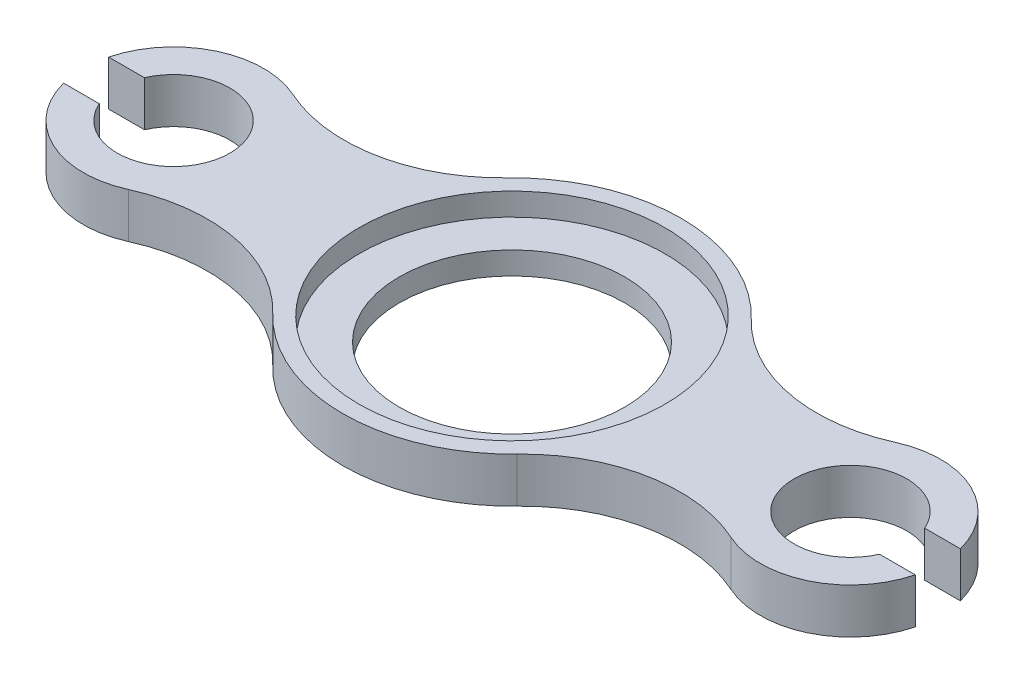
ISO-10303-21;
HEADER;
FILE_DESCRIPTION(('STEP AP214'),'2;1');
FILE_NAME('part.step','',(''),(''),'','','');
FILE_SCHEMA(('AUTOMOTIVE_DESIGN { 1 0 10303 214 1 1 1 1 }'));
ENDSEC;
DATA;
#1=APPLICATION_CONTEXT('core data for automotive mechanical design processes');
#2=APPLICATION_PROTOCOL_DEFINITION('international standard','automotive_design',2000,#1);
#3=PRODUCT_CONTEXT('',#1,'mechanical');
#4=PRODUCT('Part','Part','',(#3));
#5=PRODUCT_RELATED_PRODUCT_CATEGORY('part','',(#4));
#6=PRODUCT_DEFINITION_FORMATION('','',#4);
#7=PRODUCT_DEFINITION_CONTEXT('part definition',#1,'design');
#8=PRODUCT_DEFINITION('design','',#6,#7);
#9=PRODUCT_DEFINITION_SHAPE('','',#8);
#10=(LENGTH_UNIT() NAMED_UNIT(*) SI_UNIT(.MILLI.,.METRE.));
#11=(NAMED_UNIT(*) PLANE_ANGLE_UNIT() SI_UNIT($,.RADIAN.));
#12=(NAMED_UNIT(*) SI_UNIT($,.STERADIAN.) SOLID_ANGLE_UNIT());
#13=UNCERTAINTY_MEASURE_WITH_UNIT(LENGTH_MEASURE(1.E-05),#10,'distance_accuracy_value','');
#14=(GEOMETRIC_REPRESENTATION_CONTEXT(3) GLOBAL_UNCERTAINTY_ASSIGNED_CONTEXT((#13)) GLOBAL_UNIT_ASSIGNED_CONTEXT((#10,
#11,#12)) REPRESENTATION_CONTEXT('',''));
#15=CARTESIAN_POINT('',(0.,0.,0.));
#16=DIRECTION('',(0.,0.,1.));
#17=DIRECTION('',(1.,0.,0.));
#18=AXIS2_PLACEMENT_3D('',#15,#16,#17);
#19=CARTESIAN_POINT('',(0.,20.,0.));
#20=DIRECTION('',(0.,-1.,0.));
#21=DIRECTION('',(0.,0.,-1.));
#22=AXIS2_PLACEMENT_3D('',#19,#20,#21);
#23=CYLINDRICAL_SURFACE('',#22,50.);
#24=CARTESIAN_POINT('',(0.,0.,0.));
#25=DIRECTION('',(0.,1.,0.));
#26=DIRECTION('',(0.,0.,1.));
#27=AXIS2_PLACEMENT_3D('',#24,#25,#26);
#28=CIRCLE('',#27,50.);
#29=CARTESIAN_POINT('',(0.,0.,50.));
#30=VERTEX_POINT('',#29);
#31=EDGE_CURVE('E195',#30,#30,#28,.T.);
#32=ORIENTED_EDGE('',*,*,#31,.F.);
#33=EDGE_LOOP('',(#32));
#34=FACE_BOUND('',#33,.T.);
#35=CARTESIAN_POINT('',(0.,10.,0.));
#36=DIRECTION('',(0.,1.,0.));
#37=DIRECTION('',(0.,0.,1.));
#38=AXIS2_PLACEMENT_3D('',#35,#36,#37);
#39=CIRCLE('',#38,50.);
#40=CARTESIAN_POINT('',(0.,10.,50.));
#41=VERTEX_POINT('',#40);
#42=EDGE_CURVE('E49',#41,#41,#39,.T.);
#43=ORIENTED_EDGE('',*,*,#42,.T.);
#44=EDGE_LOOP('',(#43));
#45=FACE_BOUND('',#44,.T.);
#46=ADVANCED_FACE('F45',(#34,#45),#23,.F.);
#47=CARTESIAN_POINT('',(-104.75,20.,100.2618446868));
#48=DIRECTION('',(0.,1.,0.));
#49=DIRECTION('',(0.,0.,1.));
#50=AXIS2_PLACEMENT_3D('',#47,#48,#49);
#51=PLANE('',#50);
#52=CARTESIAN_POINT('',(0.,20.,0.));
#53=DIRECTION('',(0.,1.,0.));
#54=DIRECTION('',(0.,0.,1.));
#55=AXIS2_PLACEMENT_3D('',#52,#53,#54);
#56=CIRCLE('',#55,67.8);
#57=CARTESIAN_POINT('',(0.,20.,67.8));
#58=VERTEX_POINT('',#57);
#59=EDGE_CURVE('E589',#58,#58,#56,.T.);
#60=ORIENTED_EDGE('',*,*,#59,.F.);
#61=EDGE_LOOP('',(#60));
#62=FACE_BOUND('',#61,.T.);
#63=CARTESIAN_POINT('',(-104.75,20.,100.2618446868));
#64=DIRECTION('',(0.,-1.,0.));
#65=DIRECTION('',(0.,0.,1.));
#66=AXIS2_PLACEMENT_3D('',#63,#64,#65);
#67=CIRCLE('',#66,70.);
#68=CARTESIAN_POINT('',(-133.545454545455,20.,36.4588526133818));
#69=VERTEX_POINT('',#68);
#70=CARTESIAN_POINT('',(-54.1810344827586,20.,51.859574838));
#71=VERTEX_POINT('',#70);
#72=EDGE_CURVE('E222',#69,#71,#67,.T.);
#73=ORIENTED_EDGE('',*,*,#72,.T.);
#74=CARTESIAN_POINT('',(0.,20.,0.));
#75=DIRECTION('',(0.,1.,0.));
#76=DIRECTION('',(0.,0.,1.));
#77=AXIS2_PLACEMENT_3D('',#74,#75,#76);
#78=CIRCLE('',#77,75.);
#79=CARTESIAN_POINT('',(54.1810344827586,20.,51.859574838));
#80=VERTEX_POINT('',#79);
#81=EDGE_CURVE('E130',#71,#80,#78,.T.);
#82=ORIENTED_EDGE('',*,*,#81,.T.);
#83=CARTESIAN_POINT('',(104.75,20.,100.2618446868));
#84=DIRECTION('',(0.,-1.,0.));
#85=DIRECTION('',(0.,0.,-1.));
#86=AXIS2_PLACEMENT_3D('',#83,#84,#85);
#87=CIRCLE('',#86,70.);
#88=CARTESIAN_POINT('',(133.545454545455,20.,36.4588526133818));
#89=VERTEX_POINT('',#88);
#90=EDGE_CURVE('E262',#80,#89,#87,.T.);
#91=ORIENTED_EDGE('',*,*,#90,.T.);
#92=CARTESIAN_POINT('',(150.,20.,0.));
#93=DIRECTION('',(0.,1.,0.));
#94=DIRECTION('',(0.,0.,-1.));
#95=AXIS2_PLACEMENT_3D('',#92,#93,#94);
#96=CIRCLE('',#95,40.);
#97=CARTESIAN_POINT('',(188.729833462074,20.,9.99999999999999));
#98=VERTEX_POINT('',#97);
#99=EDGE_CURVE('E281',#89,#98,#96,.T.);
#100=ORIENTED_EDGE('',*,*,#99,.T.);
#101=DIRECTION('',(-1.,0.,0.));
#102=VECTOR('',#101,1.);
#103=CARTESIAN_POINT('',(172.912878474779,20.,10.0000000000001));
#104=LINE('',#103,#102);
#105=CARTESIAN_POINT('',(172.912878474779,20.,10.0000000000001));
#106=VERTEX_POINT('',#105);
#107=EDGE_CURVE('E278',#98,#106,#104,.T.);
#108=ORIENTED_EDGE('',*,*,#107,.T.);
#109=CARTESIAN_POINT('',(150.,20.,0.));
#110=DIRECTION('',(0.,-1.,0.));
#111=DIRECTION('',(0.,0.,-1.));
#112=AXIS2_PLACEMENT_3D('',#109,#110,#111);
#113=CIRCLE('',#112,25.);
#114=CARTESIAN_POINT('',(172.912878474779,20.,-10.));
#115=VERTEX_POINT('',#114);
#116=EDGE_CURVE('E280',#106,#115,#113,.T.);
#117=ORIENTED_EDGE('',*,*,#116,.T.);
#118=DIRECTION('',(1.,0.,0.));
#119=VECTOR('',#118,1.);
#120=CARTESIAN_POINT('',(172.912878474779,20.,-10.));
#121=LINE('',#120,#119);
#122=CARTESIAN_POINT('',(188.729833462074,20.,-10.));
#123=VERTEX_POINT('',#122);
#124=EDGE_CURVE('E283',#115,#123,#121,.T.);
#125=ORIENTED_EDGE('',*,*,#124,.T.);
#126=CARTESIAN_POINT('',(150.,20.,0.));
#127=DIRECTION('',(0.,1.,0.));
#128=DIRECTION('',(0.,0.,-1.));
#129=AXIS2_PLACEMENT_3D('',#126,#127,#128);
#130=CIRCLE('',#129,40.);
#131=CARTESIAN_POINT('',(133.545454545455,20.,-36.4588526133818));
#132=VERTEX_POINT('',#131);
#133=EDGE_CURVE('E289',#123,#132,#130,.T.);
#134=ORIENTED_EDGE('',*,*,#133,.T.);
#135=CARTESIAN_POINT('',(104.75,20.,-100.2618446868));
#136=DIRECTION('',(0.,-1.,0.));
#137=DIRECTION('',(0.,0.,-1.));
#138=AXIS2_PLACEMENT_3D('',#135,#136,#137);
#139=CIRCLE('',#138,70.);
#140=CARTESIAN_POINT('',(54.1810344827586,20.,-51.859574838));
#141=VERTEX_POINT('',#140);
#142=EDGE_CURVE('E291',#132,#141,#139,.T.);
#143=ORIENTED_EDGE('',*,*,#142,.T.);
#144=CARTESIAN_POINT('',(0.,20.,0.));
#145=DIRECTION('',(0.,1.,0.));
#146=DIRECTION('',(0.,0.,1.));
#147=AXIS2_PLACEMENT_3D('',#144,#145,#146);
#148=CIRCLE('',#147,75.);
#149=CARTESIAN_POINT('',(-54.1810344827586,20.,-51.859574838));
#150=VERTEX_POINT('',#149);
#151=EDGE_CURVE('E293',#141,#150,#148,.T.);
#152=ORIENTED_EDGE('',*,*,#151,.T.);
#153=CARTESIAN_POINT('',(-104.75,20.,-100.2618446868));
#154=DIRECTION('',(0.,-1.,0.));
#155=DIRECTION('',(0.,0.,1.));
#156=AXIS2_PLACEMENT_3D('',#153,#154,#155);
#157=CIRCLE('',#156,70.);
#158=CARTESIAN_POINT('',(-133.545454545455,20.,-36.4588526133818));
#159=VERTEX_POINT('',#158);
#160=EDGE_CURVE('E295',#150,#159,#157,.T.);
#161=ORIENTED_EDGE('',*,*,#160,.T.);
#162=CARTESIAN_POINT('',(-150.,20.,0.));
#163=DIRECTION('',(0.,1.,0.));
#164=DIRECTION('',(0.,0.,1.));
#165=AXIS2_PLACEMENT_3D('',#162,#163,#164);
#166=CIRCLE('',#165,40.);
#167=CARTESIAN_POINT('',(-188.729833462074,20.,-10.));
#168=VERTEX_POINT('',#167);
#169=EDGE_CURVE('E297',#159,#168,#166,.T.);
#170=ORIENTED_EDGE('',*,*,#169,.T.);
#171=DIRECTION('',(1.,0.,0.));
#172=VECTOR('',#171,1.);
#173=CARTESIAN_POINT('',(-172.912878474779,20.,-10.));
#174=LINE('',#173,#172);
#175=CARTESIAN_POINT('',(-172.912878474779,20.,-9.99999999999999));
#176=VERTEX_POINT('',#175);
#177=EDGE_CURVE('E173',#168,#176,#174,.T.);
#178=ORIENTED_EDGE('',*,*,#177,.T.);
#179=CARTESIAN_POINT('',(-150.,20.,0.));
#180=DIRECTION('',(0.,-1.,0.));
#181=DIRECTION('',(0.,0.,1.));
#182=AXIS2_PLACEMENT_3D('',#179,#180,#181);
#183=CIRCLE('',#182,25.);
#184=CARTESIAN_POINT('',(-172.912878474779,20.,10.0000000000001));
#185=VERTEX_POINT('',#184);
#186=EDGE_CURVE('E167',#176,#185,#183,.T.);
#187=ORIENTED_EDGE('',*,*,#186,.T.);
#188=DIRECTION('',(-1.,0.,0.));
#189=VECTOR('',#188,1.);
#190=CARTESIAN_POINT('',(-172.912878474779,20.,10.0000000000001));
#191=LINE('',#190,#189);
#192=CARTESIAN_POINT('',(-188.729833462074,20.,9.99999999999996));
#193=VERTEX_POINT('',#192);
#194=EDGE_CURVE('E171',#185,#193,#191,.T.);
#195=ORIENTED_EDGE('',*,*,#194,.T.);
#196=CARTESIAN_POINT('',(-150.,20.,0.));
#197=DIRECTION('',(0.,1.,0.));
#198=DIRECTION('',(0.,0.,1.));
#199=AXIS2_PLACEMENT_3D('',#196,#197,#198);
#200=CIRCLE('',#199,40.);
#201=EDGE_CURVE('E63',#193,#69,#200,.T.);
#202=ORIENTED_EDGE('',*,*,#201,.T.);
#203=EDGE_LOOP('',(#73,#82,#91,#100,#108,#117,#125,#134,#143,#152,#161,#170,#178,#187,#195,#202));
#204=FACE_BOUND('',#203,.T.);
#205=ADVANCED_FACE('F169',(#62,#204),#51,.T.);
#206=CARTESIAN_POINT('',(-104.75,0.,100.2618446868));
#207=DIRECTION('',(0.,1.,0.));
#208=DIRECTION('',(0.,0.,1.));
#209=AXIS2_PLACEMENT_3D('',#206,#207,#208);
#210=PLANE('',#209);
#211=CARTESIAN_POINT('',(-104.75,0.,100.2618446868));
#212=DIRECTION('',(0.,-1.,0.));
#213=DIRECTION('',(0.,0.,1.));
#214=AXIS2_PLACEMENT_3D('',#211,#212,#213);
#215=CIRCLE('',#214,70.);
#216=CARTESIAN_POINT('',(-133.545454545455,0.,36.4588526133818));
#217=VERTEX_POINT('',#216);
#218=CARTESIAN_POINT('',(-54.1810344827586,0.,51.859574838));
#219=VERTEX_POINT('',#218);
#220=EDGE_CURVE('E191',#217,#219,#215,.T.);
#221=ORIENTED_EDGE('',*,*,#220,.F.);
#222=CARTESIAN_POINT('',(-150.,0.,0.));
#223=DIRECTION('',(0.,1.,0.));
#224=DIRECTION('',(0.,0.,1.));
#225=AXIS2_PLACEMENT_3D('',#222,#223,#224);
#226=CIRCLE('',#225,40.);
#227=CARTESIAN_POINT('',(-188.729833462074,0.,9.99999999999996));
#228=VERTEX_POINT('',#227);
#229=EDGE_CURVE('E122',#228,#217,#226,.T.);
#230=ORIENTED_EDGE('',*,*,#229,.F.);
#231=DIRECTION('',(-1.,0.,0.));
#232=VECTOR('',#231,1.);
#233=CARTESIAN_POINT('',(-172.912878474779,0.,10.0000000000001));
#234=LINE('',#233,#232);
#235=CARTESIAN_POINT('',(-172.912878474779,0.,10.0000000000001));
#236=VERTEX_POINT('',#235);
#237=EDGE_CURVE('E116',#236,#228,#234,.T.);
#238=ORIENTED_EDGE('',*,*,#237,.F.);
#239=CARTESIAN_POINT('',(-150.,0.,0.));
#240=DIRECTION('',(0.,-1.,0.));
#241=DIRECTION('',(0.,0.,1.));
#242=AXIS2_PLACEMENT_3D('',#239,#240,#241);
#243=CIRCLE('',#242,25.);
#244=CARTESIAN_POINT('',(-172.912878474779,0.,-9.99999999999999));
#245=VERTEX_POINT('',#244);
#246=EDGE_CURVE('E181',#245,#236,#243,.T.);
#247=ORIENTED_EDGE('',*,*,#246,.F.);
#248=DIRECTION('',(1.,0.,0.));
#249=VECTOR('',#248,1.);
#250=CARTESIAN_POINT('',(-172.912878474779,0.,-10.));
#251=LINE('',#250,#249);
#252=CARTESIAN_POINT('',(-188.729833462074,0.,-10.));
#253=VERTEX_POINT('',#252);
#254=EDGE_CURVE('E217',#253,#245,#251,.T.);
#255=ORIENTED_EDGE('',*,*,#254,.F.);
#256=CARTESIAN_POINT('',(-150.,0.,0.));
#257=DIRECTION('',(0.,1.,0.));
#258=DIRECTION('',(0.,0.,1.));
#259=AXIS2_PLACEMENT_3D('',#256,#257,#258);
#260=CIRCLE('',#259,40.);
#261=CARTESIAN_POINT('',(-133.545454545455,0.,-36.4588526133818));
#262=VERTEX_POINT('',#261);
#263=EDGE_CURVE('E215',#262,#253,#260,.T.);
#264=ORIENTED_EDGE('',*,*,#263,.F.);
#265=CARTESIAN_POINT('',(-104.75,0.,-100.2618446868));
#266=DIRECTION('',(0.,-1.,0.));
#267=DIRECTION('',(0.,0.,1.));
#268=AXIS2_PLACEMENT_3D('',#265,#266,#267);
#269=CIRCLE('',#268,70.);
#270=CARTESIAN_POINT('',(-54.1810344827586,0.,-51.859574838));
#271=VERTEX_POINT('',#270);
#272=EDGE_CURVE('E213',#271,#262,#269,.T.);
#273=ORIENTED_EDGE('',*,*,#272,.F.);
#274=CARTESIAN_POINT('',(0.,0.,0.));
#275=DIRECTION('',(0.,1.,0.));
#276=DIRECTION('',(0.,0.,1.));
#277=AXIS2_PLACEMENT_3D('',#274,#275,#276);
#278=CIRCLE('',#277,75.);
#279=CARTESIAN_POINT('',(54.1810344827586,0.,-51.859574838));
#280=VERTEX_POINT('',#279);
#281=EDGE_CURVE('E211',#280,#271,#278,.T.);
#282=ORIENTED_EDGE('',*,*,#281,.F.);
#283=CARTESIAN_POINT('',(104.75,0.,-100.2618446868));
#284=DIRECTION('',(0.,-1.,0.));
#285=DIRECTION('',(0.,0.,-1.));
#286=AXIS2_PLACEMENT_3D('',#283,#284,#285);
#287=CIRCLE('',#286,70.);
#288=CARTESIAN_POINT('',(133.545454545455,0.,-36.4588526133818));
#289=VERTEX_POINT('',#288);
#290=EDGE_CURVE('E209',#289,#280,#287,.T.);
#291=ORIENTED_EDGE('',*,*,#290,.F.);
#292=CARTESIAN_POINT('',(150.,0.,0.));
#293=DIRECTION('',(0.,1.,0.));
#294=DIRECTION('',(0.,0.,-1.));
#295=AXIS2_PLACEMENT_3D('',#292,#293,#294);
#296=CIRCLE('',#295,40.);
#297=CARTESIAN_POINT('',(188.729833462074,0.,-10.));
#298=VERTEX_POINT('',#297);
#299=EDGE_CURVE('E207',#298,#289,#296,.T.);
#300=ORIENTED_EDGE('',*,*,#299,.F.);
#301=DIRECTION('',(1.,0.,0.));
#302=VECTOR('',#301,1.);
#303=CARTESIAN_POINT('',(172.912878474779,0.,-10.));
#304=LINE('',#303,#302);
#305=CARTESIAN_POINT('',(172.912878474779,0.,-10.));
#306=VERTEX_POINT('',#305);
#307=EDGE_CURVE('E205',#306,#298,#304,.T.);
#308=ORIENTED_EDGE('',*,*,#307,.F.);
#309=CARTESIAN_POINT('',(150.,0.,0.));
#310=DIRECTION('',(0.,-1.,0.));
#311=DIRECTION('',(0.,0.,-1.));
#312=AXIS2_PLACEMENT_3D('',#309,#310,#311);
#313=CIRCLE('',#312,25.);
#314=CARTESIAN_POINT('',(172.912878474779,0.,10.0000000000001));
#315=VERTEX_POINT('',#314);
#316=EDGE_CURVE('E203',#315,#306,#313,.T.);
#317=ORIENTED_EDGE('',*,*,#316,.F.);
#318=DIRECTION('',(-1.,0.,0.));
#319=VECTOR('',#318,1.);
#320=CARTESIAN_POINT('',(172.912878474779,0.,10.0000000000001));
#321=LINE('',#320,#319);
#322=CARTESIAN_POINT('',(188.729833462074,0.,9.99999999999999));
#323=VERTEX_POINT('',#322);
#324=EDGE_CURVE('E201',#323,#315,#321,.T.);
#325=ORIENTED_EDGE('',*,*,#324,.F.);
#326=CARTESIAN_POINT('',(150.,0.,0.));
#327=DIRECTION('',(0.,1.,0.));
#328=DIRECTION('',(0.,0.,-1.));
#329=AXIS2_PLACEMENT_3D('',#326,#327,#328);
#330=CIRCLE('',#329,40.);
#331=CARTESIAN_POINT('',(133.545454545455,0.,36.4588526133818));
#332=VERTEX_POINT('',#331);
#333=EDGE_CURVE('E199',#332,#323,#330,.T.);
#334=ORIENTED_EDGE('',*,*,#333,.F.);
#335=CARTESIAN_POINT('',(104.75,0.,100.2618446868));
#336=DIRECTION('',(0.,-1.,0.));
#337=DIRECTION('',(0.,0.,-1.));
#338=AXIS2_PLACEMENT_3D('',#335,#336,#337);
#339=CIRCLE('',#338,70.);
#340=CARTESIAN_POINT('',(54.1810344827586,0.,51.859574838));
#341=VERTEX_POINT('',#340);
#342=EDGE_CURVE('E197',#341,#332,#339,.T.);
#343=ORIENTED_EDGE('',*,*,#342,.F.);
#344=CARTESIAN_POINT('',(0.,0.,0.));
#345=DIRECTION('',(0.,1.,0.));
#346=DIRECTION('',(0.,0.,1.));
#347=AXIS2_PLACEMENT_3D('',#344,#345,#346);
#348=CIRCLE('',#347,75.);
#349=EDGE_CURVE('E194',#219,#341,#348,.T.);
#350=ORIENTED_EDGE('',*,*,#349,.F.);
#351=EDGE_LOOP('',(#221,#230,#238,#247,#255,#264,#273,#282,#291,#300,#308,#317,#325,#334,#343,#350));
#352=FACE_BOUND('',#351,.T.);
#353=ORIENTED_EDGE('',*,*,#31,.T.);
#354=EDGE_LOOP('',(#353));
#355=FACE_BOUND('',#354,.T.);
#356=ADVANCED_FACE('F266',(#352,#355),#210,.F.);
#357=CARTESIAN_POINT('',(-104.75,20.,100.2618446868));
#358=DIRECTION('',(0.,-1.,0.));
#359=DIRECTION('',(0.,0.,-1.));
#360=AXIS2_PLACEMENT_3D('',#357,#358,#359);
#361=CYLINDRICAL_SURFACE('',#360,70.);
#362=ORIENTED_EDGE('',*,*,#220,.T.);
#363=DIRECTION('',(0.,-1.,0.));
#364=VECTOR('',#363,1.);
#365=CARTESIAN_POINT('',(-54.1810344827586,20.,51.859574838));
#366=LINE('',#365,#364);
#367=EDGE_CURVE('E11',#71,#219,#366,.T.);
#368=ORIENTED_EDGE('',*,*,#367,.F.);
#369=ORIENTED_EDGE('',*,*,#72,.F.);
#370=DIRECTION('',(0.,-1.,0.));
#371=VECTOR('',#370,1.);
#372=CARTESIAN_POINT('',(-133.545454545455,20.,36.4588526133818));
#373=LINE('',#372,#371);
#374=EDGE_CURVE('E187',#69,#217,#373,.T.);
#375=ORIENTED_EDGE('',*,*,#374,.T.);
#376=EDGE_LOOP('',(#362,#368,#369,#375));
#377=FACE_BOUND('',#376,.T.);
#378=ADVANCED_FACE('F47',(#377),#361,.F.);
#379=CARTESIAN_POINT('',(0.,20.,0.));
#380=DIRECTION('',(0.,-1.,0.));
#381=DIRECTION('',(0.,0.,-1.));
#382=AXIS2_PLACEMENT_3D('',#379,#380,#381);
#383=CYLINDRICAL_SURFACE('',#382,75.);
#384=ORIENTED_EDGE('',*,*,#349,.T.);
#385=DIRECTION('',(0.,-1.,0.));
#386=VECTOR('',#385,1.);
#387=CARTESIAN_POINT('',(54.1810344827586,20.,51.859574838));
#388=LINE('',#387,#386);
#389=EDGE_CURVE('E55',#80,#341,#388,.T.);
#390=ORIENTED_EDGE('',*,*,#389,.F.);
#391=ORIENTED_EDGE('',*,*,#81,.F.);
#392=ORIENTED_EDGE('',*,*,#367,.T.);
#393=EDGE_LOOP('',(#384,#390,#391,#392));
#394=FACE_BOUND('',#393,.T.);
#395=ADVANCED_FACE('F339',(#394),#383,.T.);
#396=CARTESIAN_POINT('',(104.75,20.,100.2618446868));
#397=DIRECTION('',(0.,-1.,0.));
#398=DIRECTION('',(0.,0.,-1.));
#399=AXIS2_PLACEMENT_3D('',#396,#397,#398);
#400=CYLINDRICAL_SURFACE('',#399,70.);
#401=ORIENTED_EDGE('',*,*,#342,.T.);
#402=DIRECTION('',(0.,-1.,0.));
#403=VECTOR('',#402,1.);
#404=CARTESIAN_POINT('',(133.545454545455,20.,36.4588526133818));
#405=LINE('',#404,#403);
#406=EDGE_CURVE('E253',#89,#332,#405,.T.);
#407=ORIENTED_EDGE('',*,*,#406,.F.);
#408=ORIENTED_EDGE('',*,*,#90,.F.);
#409=ORIENTED_EDGE('',*,*,#389,.T.);
#410=EDGE_LOOP('',(#401,#407,#408,#409));
#411=FACE_BOUND('',#410,.T.);
#412=ADVANCED_FACE('F260',(#411),#400,.F.);
#413=CARTESIAN_POINT('',(150.,20.,0.));
#414=DIRECTION('',(0.,-1.,0.));
#415=DIRECTION('',(0.,0.,-1.));
#416=AXIS2_PLACEMENT_3D('',#413,#414,#415);
#417=CYLINDRICAL_SURFACE('',#416,40.);
#418=ORIENTED_EDGE('',*,*,#333,.T.);
#419=DIRECTION('',(0.,-1.,0.));
#420=VECTOR('',#419,1.);
#421=CARTESIAN_POINT('',(188.729833462074,20.,9.99999999999999));
#422=LINE('',#421,#420);
#423=EDGE_CURVE('E250',#98,#323,#422,.T.);
#424=ORIENTED_EDGE('',*,*,#423,.F.);
#425=ORIENTED_EDGE('',*,*,#99,.F.);
#426=ORIENTED_EDGE('',*,*,#406,.T.);
#427=EDGE_LOOP('',(#418,#424,#425,#426));
#428=FACE_BOUND('',#427,.T.);
#429=ADVANCED_FACE('F272',(#428),#417,.T.);
#430=CARTESIAN_POINT('',(172.912878474779,20.,10.0000000000001));
#431=DIRECTION('',(0.,0.,1.));
#432=DIRECTION('',(1.,0.,0.));
#433=AXIS2_PLACEMENT_3D('',#430,#431,#432);
#434=PLANE('',#433);
#435=ORIENTED_EDGE('',*,*,#324,.T.);
#436=DIRECTION('',(0.,-1.,0.));
#437=VECTOR('',#436,1.);
#438=CARTESIAN_POINT('',(172.912878474779,20.,10.0000000000001));
#439=LINE('',#438,#437);
#440=EDGE_CURVE('E247',#106,#315,#439,.T.);
#441=ORIENTED_EDGE('',*,*,#440,.F.);
#442=ORIENTED_EDGE('',*,*,#107,.F.);
#443=ORIENTED_EDGE('',*,*,#423,.T.);
#444=EDGE_LOOP('',(#435,#441,#442,#443));
#445=FACE_BOUND('',#444,.T.);
#446=ADVANCED_FACE('F276',(#445),#434,.F.);
#447=CARTESIAN_POINT('',(150.,20.,0.));
#448=DIRECTION('',(0.,-1.,0.));
#449=DIRECTION('',(0.,0.,-1.));
#450=AXIS2_PLACEMENT_3D('',#447,#448,#449);
#451=CYLINDRICAL_SURFACE('',#450,25.);
#452=ORIENTED_EDGE('',*,*,#316,.T.);
#453=DIRECTION('',(0.,-1.,0.));
#454=VECTOR('',#453,1.);
#455=CARTESIAN_POINT('',(172.912878474779,20.,-10.));
#456=LINE('',#455,#454);
#457=EDGE_CURVE('E244',#115,#306,#456,.T.);
#458=ORIENTED_EDGE('',*,*,#457,.F.);
#459=ORIENTED_EDGE('',*,*,#116,.F.);
#460=ORIENTED_EDGE('',*,*,#440,.T.);
#461=EDGE_LOOP('',(#452,#458,#459,#460));
#462=FACE_BOUND('',#461,.T.);
#463=ADVANCED_FACE('F352',(#462),#451,.F.);
#464=CARTESIAN_POINT('',(172.912878474779,20.,-10.));
#465=DIRECTION('',(0.,0.,-1.));
#466=DIRECTION('',(-1.,0.,0.));
#467=AXIS2_PLACEMENT_3D('',#464,#465,#466);
#468=PLANE('',#467);
#469=ORIENTED_EDGE('',*,*,#307,.T.);
#470=DIRECTION('',(0.,-1.,0.));
#471=VECTOR('',#470,1.);
#472=CARTESIAN_POINT('',(188.729833462074,20.,-10.));
#473=LINE('',#472,#471);
#474=EDGE_CURVE('E241',#123,#298,#473,.T.);
#475=ORIENTED_EDGE('',*,*,#474,.F.);
#476=ORIENTED_EDGE('',*,*,#124,.F.);
#477=ORIENTED_EDGE('',*,*,#457,.T.);
#478=EDGE_LOOP('',(#469,#475,#476,#477));
#479=FACE_BOUND('',#478,.T.);
#480=ADVANCED_FACE('F355',(#479),#468,.F.);
#481=CARTESIAN_POINT('',(150.,20.,0.));
#482=DIRECTION('',(0.,-1.,0.));
#483=DIRECTION('',(0.,0.,-1.));
#484=AXIS2_PLACEMENT_3D('',#481,#482,#483);
#485=CYLINDRICAL_SURFACE('',#484,40.);
#486=ORIENTED_EDGE('',*,*,#299,.T.);
#487=DIRECTION('',(0.,-1.,0.));
#488=VECTOR('',#487,1.);
#489=CARTESIAN_POINT('',(133.545454545455,20.,-36.4588526133818));
#490=LINE('',#489,#488);
#491=EDGE_CURVE('E238',#132,#289,#490,.T.);
#492=ORIENTED_EDGE('',*,*,#491,.F.);
#493=ORIENTED_EDGE('',*,*,#133,.F.);
#494=ORIENTED_EDGE('',*,*,#474,.T.);
#495=EDGE_LOOP('',(#486,#492,#493,#494));
#496=FACE_BOUND('',#495,.T.);
#497=ADVANCED_FACE('F359',(#496),#485,.T.);
#498=CARTESIAN_POINT('',(104.75,20.,-100.2618446868));
#499=DIRECTION('',(0.,-1.,0.));
#500=DIRECTION('',(0.,0.,-1.));
#501=AXIS2_PLACEMENT_3D('',#498,#499,#500);
#502=CYLINDRICAL_SURFACE('',#501,70.);
#503=ORIENTED_EDGE('',*,*,#290,.T.);
#504=DIRECTION('',(0.,-1.,0.));
#505=VECTOR('',#504,1.);
#506=CARTESIAN_POINT('',(54.1810344827586,20.,-51.859574838));
#507=LINE('',#506,#505);
#508=EDGE_CURVE('E235',#141,#280,#507,.T.);
#509=ORIENTED_EDGE('',*,*,#508,.F.);
#510=ORIENTED_EDGE('',*,*,#142,.F.);
#511=ORIENTED_EDGE('',*,*,#491,.T.);
#512=EDGE_LOOP('',(#503,#509,#510,#511));
#513=FACE_BOUND('',#512,.T.);
#514=ADVANCED_FACE('F363',(#513),#502,.F.);
#515=CARTESIAN_POINT('',(0.,20.,0.));
#516=DIRECTION('',(0.,-1.,0.));
#517=DIRECTION('',(0.,0.,-1.));
#518=AXIS2_PLACEMENT_3D('',#515,#516,#517);
#519=CYLINDRICAL_SURFACE('',#518,75.);
#520=ORIENTED_EDGE('',*,*,#281,.T.);
#521=DIRECTION('',(0.,-1.,0.));
#522=VECTOR('',#521,1.);
#523=CARTESIAN_POINT('',(-54.1810344827586,20.,-51.859574838));
#524=LINE('',#523,#522);
#525=EDGE_CURVE('E232',#150,#271,#524,.T.);
#526=ORIENTED_EDGE('',*,*,#525,.F.);
#527=ORIENTED_EDGE('',*,*,#151,.F.);
#528=ORIENTED_EDGE('',*,*,#508,.T.);
#529=EDGE_LOOP('',(#520,#526,#527,#528));
#530=FACE_BOUND('',#529,.T.);
#531=ADVANCED_FACE('F367',(#530),#519,.T.);
#532=CARTESIAN_POINT('',(-104.75,20.,-100.2618446868));
#533=DIRECTION('',(0.,-1.,0.));
#534=DIRECTION('',(0.,0.,-1.));
#535=AXIS2_PLACEMENT_3D('',#532,#533,#534);
#536=CYLINDRICAL_SURFACE('',#535,70.);
#537=ORIENTED_EDGE('',*,*,#272,.T.);
#538=DIRECTION('',(0.,-1.,0.));
#539=VECTOR('',#538,1.);
#540=CARTESIAN_POINT('',(-133.545454545455,20.,-36.4588526133818));
#541=LINE('',#540,#539);
#542=EDGE_CURVE('E229',#159,#262,#541,.T.);
#543=ORIENTED_EDGE('',*,*,#542,.F.);
#544=ORIENTED_EDGE('',*,*,#160,.F.);
#545=ORIENTED_EDGE('',*,*,#525,.T.);
#546=EDGE_LOOP('',(#537,#543,#544,#545));
#547=FACE_BOUND('',#546,.T.);
#548=ADVANCED_FACE('F371',(#547),#536,.F.);
#549=CARTESIAN_POINT('',(-150.,20.,0.));
#550=DIRECTION('',(0.,-1.,0.));
#551=DIRECTION('',(0.,0.,-1.));
#552=AXIS2_PLACEMENT_3D('',#549,#550,#551);
#553=CYLINDRICAL_SURFACE('',#552,40.);
#554=ORIENTED_EDGE('',*,*,#263,.T.);
#555=DIRECTION('',(0.,-1.,0.));
#556=VECTOR('',#555,1.);
#557=CARTESIAN_POINT('',(-188.729833462074,20.,-10.));
#558=LINE('',#557,#556);
#559=EDGE_CURVE('E226',#168,#253,#558,.T.);
#560=ORIENTED_EDGE('',*,*,#559,.F.);
#561=ORIENTED_EDGE('',*,*,#169,.F.);
#562=ORIENTED_EDGE('',*,*,#542,.T.);
#563=EDGE_LOOP('',(#554,#560,#561,#562));
#564=FACE_BOUND('',#563,.T.);
#565=ADVANCED_FACE('F303',(#564),#553,.T.);
#566=CARTESIAN_POINT('',(-172.912878474779,20.,-10.));
#567=DIRECTION('',(0.,0.,-1.));
#568=DIRECTION('',(-1.,0.,0.));
#569=AXIS2_PLACEMENT_3D('',#566,#567,#568);
#570=PLANE('',#569);
#571=ORIENTED_EDGE('',*,*,#254,.T.);
#572=DIRECTION('',(0.,-1.,0.));
#573=VECTOR('',#572,1.);
#574=CARTESIAN_POINT('',(-172.912878474779,20.,-9.99999999999999));
#575=LINE('',#574,#573);
#576=EDGE_CURVE('E182',#176,#245,#575,.T.);
#577=ORIENTED_EDGE('',*,*,#576,.F.);
#578=ORIENTED_EDGE('',*,*,#177,.F.);
#579=ORIENTED_EDGE('',*,*,#559,.T.);
#580=EDGE_LOOP('',(#571,#577,#578,#579));
#581=FACE_BOUND('',#580,.T.);
#582=ADVANCED_FACE('F307',(#581),#570,.F.);
#583=CARTESIAN_POINT('',(-150.,20.,0.));
#584=DIRECTION('',(0.,-1.,0.));
#585=DIRECTION('',(0.,0.,-1.));
#586=AXIS2_PLACEMENT_3D('',#583,#584,#585);
#587=CYLINDRICAL_SURFACE('',#586,25.);
#588=ORIENTED_EDGE('',*,*,#246,.T.);
#589=DIRECTION('',(0.,-1.,0.));
#590=VECTOR('',#589,1.);
#591=CARTESIAN_POINT('',(-172.912878474779,20.,10.0000000000001));
#592=LINE('',#591,#590);
#593=EDGE_CURVE('E178',#185,#236,#592,.T.);
#594=ORIENTED_EDGE('',*,*,#593,.F.);
#595=ORIENTED_EDGE('',*,*,#186,.F.);
#596=ORIENTED_EDGE('',*,*,#576,.T.);
#597=EDGE_LOOP('',(#588,#594,#595,#596));
#598=FACE_BOUND('',#597,.T.);
#599=ADVANCED_FACE('F179',(#598),#587,.F.);
#600=CARTESIAN_POINT('',(-172.912878474779,20.,10.0000000000001));
#601=DIRECTION('',(0.,0.,1.));
#602=DIRECTION('',(1.,0.,0.));
#603=AXIS2_PLACEMENT_3D('',#600,#601,#602);
#604=PLANE('',#603);
#605=ORIENTED_EDGE('',*,*,#237,.T.);
#606=DIRECTION('',(0.,-1.,0.));
#607=VECTOR('',#606,1.);
#608=CARTESIAN_POINT('',(-188.729833462074,20.,9.99999999999996));
#609=LINE('',#608,#607);
#610=EDGE_CURVE('E183',#193,#228,#609,.T.);
#611=ORIENTED_EDGE('',*,*,#610,.F.);
#612=ORIENTED_EDGE('',*,*,#194,.F.);
#613=ORIENTED_EDGE('',*,*,#593,.T.);
#614=EDGE_LOOP('',(#605,#611,#612,#613));
#615=FACE_BOUND('',#614,.T.);
#616=ADVANCED_FACE('F185',(#615),#604,.F.);
#617=CARTESIAN_POINT('',(-150.,20.,0.));
#618=DIRECTION('',(0.,-1.,0.));
#619=DIRECTION('',(0.,0.,-1.));
#620=AXIS2_PLACEMENT_3D('',#617,#618,#619);
#621=CYLINDRICAL_SURFACE('',#620,40.);
#622=ORIENTED_EDGE('',*,*,#229,.T.);
#623=ORIENTED_EDGE('',*,*,#374,.F.);
#624=ORIENTED_EDGE('',*,*,#201,.F.);
#625=ORIENTED_EDGE('',*,*,#610,.T.);
#626=EDGE_LOOP('',(#622,#623,#624,#625));
#627=FACE_BOUND('',#626,.T.);
#628=ADVANCED_FACE('F311',(#627),#621,.T.);
#629=CARTESIAN_POINT('',(0.,10.,0.));
#630=DIRECTION('',(0.,1.,0.));
#631=DIRECTION('',(0.,0.,1.));
#632=AXIS2_PLACEMENT_3D('',#629,#630,#631);
#633=CYLINDRICAL_SURFACE('',#632,67.8);
#634=CARTESIAN_POINT('',(0.,10.,0.));
#635=DIRECTION('',(0.,1.,0.));
#636=DIRECTION('',(0.,0.,1.));
#637=AXIS2_PLACEMENT_3D('',#634,#635,#636);
#638=CIRCLE('',#637,67.8);
#639=CARTESIAN_POINT('',(0.,10.,67.8));
#640=VERTEX_POINT('',#639);
#641=EDGE_CURVE('E588',#640,#640,#638,.T.);
#642=ORIENTED_EDGE('',*,*,#641,.F.);
#643=EDGE_LOOP('',(#642));
#644=FACE_BOUND('',#643,.T.);
#645=ORIENTED_EDGE('',*,*,#59,.T.);
#646=EDGE_LOOP('',(#645));
#647=FACE_BOUND('',#646,.T.);
#648=ADVANCED_FACE('F313',(#644,#647),#633,.F.);
#649=CARTESIAN_POINT('',(0.,10.,0.));
#650=DIRECTION('',(0.,1.,0.));
#651=DIRECTION('',(0.,0.,1.));
#652=AXIS2_PLACEMENT_3D('',#649,#650,#651);
#653=PLANE('',#652);
#654=ORIENTED_EDGE('',*,*,#42,.F.);
#655=EDGE_LOOP('',(#654));
#656=FACE_BOUND('',#655,.T.);
#657=ORIENTED_EDGE('',*,*,#641,.T.);
#658=EDGE_LOOP('',(#657));
#659=FACE_BOUND('',#658,.T.);
#660=ADVANCED_FACE('F319',(#656,#659),#653,.T.);
#661=CLOSED_SHELL('',(#46,#205,#356,#378,#395,#412,#429,#446,#463,#480,#497,#514,#531,#548,#565,
#582,#599,#616,#628,#648,#660));
#662=MANIFOLD_SOLID_BREP('B2',#661);
#663=ADVANCED_BREP_SHAPE_REPRESENTATION('',(#18,#662),#14);
#664=SHAPE_DEFINITION_REPRESENTATION(#9,#663);
ENDSEC;
END-ISO-10303-21;
